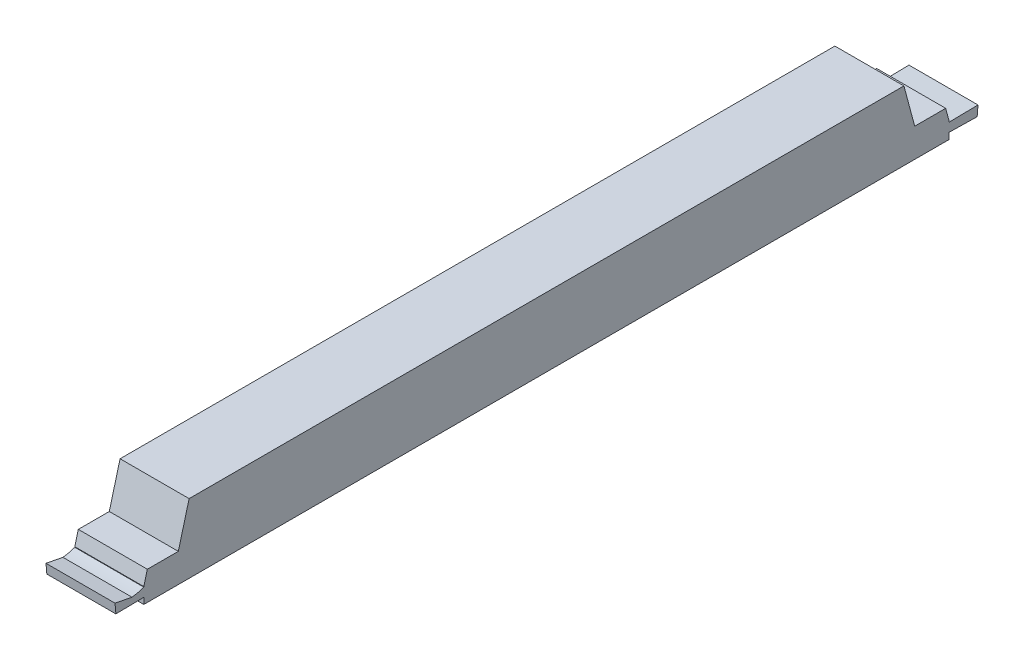
ISO-10303-21;
HEADER;
FILE_DESCRIPTION(('STEP AP214'),'2;1');
FILE_NAME('part.step','',(''),(''),'','','');
FILE_SCHEMA(('AUTOMOTIVE_DESIGN { 1 0 10303 214 1 1 1 1 }'));
ENDSEC;
DATA;
#1=APPLICATION_CONTEXT('core data for automotive mechanical design processes');
#2=APPLICATION_PROTOCOL_DEFINITION('international standard','automotive_design',2000,#1);
#3=PRODUCT_CONTEXT('',#1,'mechanical');
#4=PRODUCT('Part','Part','',(#3));
#5=PRODUCT_RELATED_PRODUCT_CATEGORY('part','',(#4));
#6=PRODUCT_DEFINITION_FORMATION('','',#4);
#7=PRODUCT_DEFINITION_CONTEXT('part definition',#1,'design');
#8=PRODUCT_DEFINITION('design','',#6,#7);
#9=PRODUCT_DEFINITION_SHAPE('','',#8);
#10=(LENGTH_UNIT() NAMED_UNIT(*) SI_UNIT(.MILLI.,.METRE.));
#11=(NAMED_UNIT(*) PLANE_ANGLE_UNIT() SI_UNIT($,.RADIAN.));
#12=(NAMED_UNIT(*) SI_UNIT($,.STERADIAN.) SOLID_ANGLE_UNIT());
#13=UNCERTAINTY_MEASURE_WITH_UNIT(LENGTH_MEASURE(1.E-05),#10,'distance_accuracy_value','');
#14=(GEOMETRIC_REPRESENTATION_CONTEXT(3) GLOBAL_UNCERTAINTY_ASSIGNED_CONTEXT((#13)) GLOBAL_UNIT_ASSIGNED_CONTEXT((#10,
#11,#12)) REPRESENTATION_CONTEXT('',''));
#15=CARTESIAN_POINT('',(0.,0.,0.));
#16=DIRECTION('',(0.,0.,1.));
#17=DIRECTION('',(1.,0.,0.));
#18=AXIS2_PLACEMENT_3D('',#15,#16,#17);
#19=CARTESIAN_POINT('',(0.,0.,150.));
#20=DIRECTION('',(-1.,0.,0.));
#21=DIRECTION('',(0.,0.,1.));
#22=AXIS2_PLACEMENT_3D('',#19,#20,#21);
#23=PLANE('',#22);
#24=DIRECTION('',(0.,-0.996194698091746,0.0871557427476513));
#25=VECTOR('',#24,1.);
#26=CARTESIAN_POINT('',(0.,2.7,0.));
#27=LINE('',#26,#25);
#28=CARTESIAN_POINT('',(0.,2.7,0.));
#29=VERTEX_POINT('',#28);
#30=CARTESIAN_POINT('',(0.,1.00259214599518,0.148503944605277));
#31=VERTEX_POINT('',#30);
#32=EDGE_CURVE('E179',#29,#31,#27,.T.);
#33=ORIENTED_EDGE('',*,*,#32,.T.);
#34=DIRECTION('',(0.,-0.0174524064372764,-0.999847695156391));
#35=VECTOR('',#34,1.);
#36=CARTESIAN_POINT('',(0.,1.08727532464105,5.));
#37=LINE('',#36,#35);
#38=CARTESIAN_POINT('',(0.,1.08727532464105,5.));
#39=VERTEX_POINT('',#38);
#40=EDGE_CURVE('E189',#39,#31,#37,.T.);
#41=ORIENTED_EDGE('',*,*,#40,.F.);
#42=DIRECTION('',(0.,1.,0.));
#43=VECTOR('',#42,1.);
#44=CARTESIAN_POINT('',(0.,0.,5.));
#45=LINE('',#44,#43);
#46=CARTESIAN_POINT('',(0.,0.,5.));
#47=VERTEX_POINT('',#46);
#48=EDGE_CURVE('E297',#47,#39,#45,.T.);
#49=ORIENTED_EDGE('',*,*,#48,.F.);
#50=DIRECTION('',(0.,0.,-1.));
#51=VECTOR('',#50,1.);
#52=CARTESIAN_POINT('',(0.,0.,150.));
#53=LINE('',#52,#51);
#54=CARTESIAN_POINT('',(0.,0.,145.));
#55=VERTEX_POINT('',#54);
#56=EDGE_CURVE('E12',#55,#47,#53,.T.);
#57=ORIENTED_EDGE('',*,*,#56,.F.);
#58=DIRECTION('',(0.,-1.,0.));
#59=VECTOR('',#58,1.);
#60=CARTESIAN_POINT('',(0.,1.,145.));
#61=LINE('',#60,#59);
#62=CARTESIAN_POINT('',(0.,1.08727532464106,145.));
#63=VERTEX_POINT('',#62);
#64=EDGE_CURVE('E290',#63,#55,#61,.T.);
#65=ORIENTED_EDGE('',*,*,#64,.F.);
#66=DIRECTION('',(0.,-0.0174524064372768,0.999847695156391));
#67=VECTOR('',#66,1.);
#68=CARTESIAN_POINT('',(0.,1.08727532464106,145.));
#69=LINE('',#68,#67);
#70=CARTESIAN_POINT('',(0.,1.00259214599518,149.851496055395));
#71=VERTEX_POINT('',#70);
#72=EDGE_CURVE('E228',#63,#71,#69,.T.);
#73=ORIENTED_EDGE('',*,*,#72,.T.);
#74=DIRECTION('',(0.,0.996194698091746,0.0871557427476516));
#75=VECTOR('',#74,1.);
#76=CARTESIAN_POINT('',(0.,1.00259214599518,149.851496055395));
#77=LINE('',#76,#75);
#78=CARTESIAN_POINT('',(0.,2.7,150.));
#79=VERTEX_POINT('',#78);
#80=EDGE_CURVE('E412',#71,#79,#77,.T.);
#81=ORIENTED_EDGE('',*,*,#80,.T.);
#82=DIRECTION('',(0.,0.190808995376531,0.981627183447667));
#83=VECTOR('',#82,1.);
#84=CARTESIAN_POINT('',(0.,2.12757301387041,147.055118449657));
#85=LINE('',#84,#83);
#86=CARTESIAN_POINT('',(0.,2.12757301387041,147.055118449657));
#87=VERTEX_POINT('',#86);
#88=EDGE_CURVE('E399',#87,#79,#85,.T.);
#89=ORIENTED_EDGE('',*,*,#88,.F.);
#90=CARTESIAN_POINT('',(0.,10.0880332251018,147.849519623751));
#91=DIRECTION('',(1.,0.,0.));
#92=DIRECTION('',(0.,0.,-1.));
#93=AXIS2_PLACEMENT_3D('',#90,#91,#92);
#94=CIRCLE('',#93,8.);
#95=CARTESIAN_POINT('',(0.,2.61272467535895,145.));
#96=VERTEX_POINT('',#95);
#97=EDGE_CURVE('E397',#87,#96,#94,.T.);
#98=ORIENTED_EDGE('',*,*,#97,.T.);
#99=DIRECTION('',(0.,-1.,0.));
#100=VECTOR('',#99,1.);
#101=CARTESIAN_POINT('',(0.,2.7,145.));
#102=LINE('',#101,#100);
#103=CARTESIAN_POINT('',(0.,2.7,145.));
#104=VERTEX_POINT('',#103);
#105=EDGE_CURVE('E219',#104,#96,#102,.T.);
#106=ORIENTED_EDGE('',*,*,#105,.F.);
#107=DIRECTION('',(0.,0.965925826289069,-0.258819045102517));
#108=VECTOR('',#107,1.);
#109=CARTESIAN_POINT('',(0.,2.7,145.));
#110=LINE('',#109,#108);
#111=CARTESIAN_POINT('',(0.,5.,144.383716857408));
#112=VERTEX_POINT('',#111);
#113=EDGE_CURVE('E237',#104,#112,#110,.T.);
#114=ORIENTED_EDGE('',*,*,#113,.T.);
#115=DIRECTION('',(0.,0.,-1.));
#116=VECTOR('',#115,1.);
#117=CARTESIAN_POINT('',(0.,5.,144.383716857408));
#118=LINE('',#117,#116);
#119=CARTESIAN_POINT('',(0.,5.,139.));
#120=VERTEX_POINT('',#119);
#121=EDGE_CURVE('E251',#112,#120,#118,.T.);
#122=ORIENTED_EDGE('',*,*,#121,.T.);
#123=DIRECTION('',(0.,0.965925826289069,-0.258819045102518));
#124=VECTOR('',#123,1.);
#125=CARTESIAN_POINT('',(0.,5.,139.));
#126=LINE('',#125,#124);
#127=CARTESIAN_POINT('',(0.,12.,137.124355652982));
#128=VERTEX_POINT('',#127);
#129=EDGE_CURVE('E249',#120,#128,#126,.T.);
#130=ORIENTED_EDGE('',*,*,#129,.T.);
#131=DIRECTION('',(0.,0.,-1.));
#132=VECTOR('',#131,1.);
#133=CARTESIAN_POINT('',(0.,12.,150.));
#134=LINE('',#133,#132);
#135=CARTESIAN_POINT('',(0.,12.,12.8756443470179));
#136=VERTEX_POINT('',#135);
#137=EDGE_CURVE('E50',#128,#136,#134,.T.);
#138=ORIENTED_EDGE('',*,*,#137,.T.);
#139=DIRECTION('',(0.,0.965925826289069,0.25881904510252));
#140=VECTOR('',#139,1.);
#141=CARTESIAN_POINT('',(0.,5.,11.));
#142=LINE('',#141,#140);
#143=CARTESIAN_POINT('',(0.,5.,11.));
#144=VERTEX_POINT('',#143);
#145=EDGE_CURVE('E275',#144,#136,#142,.T.);
#146=ORIENTED_EDGE('',*,*,#145,.F.);
#147=DIRECTION('',(0.,0.,1.));
#148=VECTOR('',#147,1.);
#149=CARTESIAN_POINT('',(0.,5.,5.61628314259158));
#150=LINE('',#149,#148);
#151=CARTESIAN_POINT('',(0.,5.,5.61628314259158));
#152=VERTEX_POINT('',#151);
#153=EDGE_CURVE('E273',#152,#144,#150,.T.);
#154=ORIENTED_EDGE('',*,*,#153,.F.);
#155=DIRECTION('',(0.,0.965925826289069,0.258819045102518));
#156=VECTOR('',#155,1.);
#157=CARTESIAN_POINT('',(0.,2.7,5.));
#158=LINE('',#157,#156);
#159=CARTESIAN_POINT('',(0.,2.7,5.));
#160=VERTEX_POINT('',#159);
#161=EDGE_CURVE('E271',#160,#152,#158,.T.);
#162=ORIENTED_EDGE('',*,*,#161,.F.);
#163=DIRECTION('',(0.,-1.,0.));
#164=VECTOR('',#163,1.);
#165=CARTESIAN_POINT('',(0.,2.7,5.));
#166=LINE('',#165,#164);
#167=CARTESIAN_POINT('',(0.,2.61272467535895,5.));
#168=VERTEX_POINT('',#167);
#169=EDGE_CURVE('E208',#160,#168,#166,.T.);
#170=ORIENTED_EDGE('',*,*,#169,.T.);
#171=DIRECTION('',(0.,0.0174524064372769,-0.999847695156391));
#172=VECTOR('',#171,1.);
#173=CARTESIAN_POINT('',(0.,2.61272467535895,5.));
#174=LINE('',#173,#172);
#175=EDGE_CURVE('E192',#168,#29,#174,.T.);
#176=ORIENTED_EDGE('',*,*,#175,.T.);
#177=EDGE_LOOP('',(#33,#41,#49,#57,#65,#73,#81,#89,#98,#106,#114,#122,#130,#138,#146,#154,#162,
#170,#176));
#178=FACE_BOUND('',#177,.T.);
#179=ADVANCED_FACE('F47',(#178),#23,.T.);
#180=CARTESIAN_POINT('',(12.,0.,150.));
#181=DIRECTION('',(-1.,0.,0.));
#182=DIRECTION('',(0.,0.,1.));
#183=AXIS2_PLACEMENT_3D('',#180,#181,#182);
#184=PLANE('',#183);
#185=DIRECTION('',(0.,-0.0174524064372764,-0.999847695156391));
#186=VECTOR('',#185,1.);
#187=CARTESIAN_POINT('',(12.,1.08727532464105,5.));
#188=LINE('',#187,#186);
#189=CARTESIAN_POINT('',(12.,1.08727532464105,5.));
#190=VERTEX_POINT('',#189);
#191=CARTESIAN_POINT('',(12.,1.00259214599518,0.148503944605275));
#192=VERTEX_POINT('',#191);
#193=EDGE_CURVE('E198',#190,#192,#188,.T.);
#194=ORIENTED_EDGE('',*,*,#193,.T.);
#195=DIRECTION('',(0.,-0.996194698091746,0.0871557427476513));
#196=VECTOR('',#195,1.);
#197=CARTESIAN_POINT('',(12.,2.7,0.));
#198=LINE('',#197,#196);
#199=CARTESIAN_POINT('',(12.,2.7,0.));
#200=VERTEX_POINT('',#199);
#201=EDGE_CURVE('E63',#200,#192,#198,.T.);
#202=ORIENTED_EDGE('',*,*,#201,.F.);
#203=DIRECTION('',(0.,0.0174524064372769,-0.999847695156391));
#204=VECTOR('',#203,1.);
#205=CARTESIAN_POINT('',(12.,2.61272467535895,5.));
#206=LINE('',#205,#204);
#207=CARTESIAN_POINT('',(12.,2.61272467535895,5.));
#208=VERTEX_POINT('',#207);
#209=EDGE_CURVE('E210',#208,#200,#206,.T.);
#210=ORIENTED_EDGE('',*,*,#209,.F.);
#211=DIRECTION('',(0.,-1.,0.));
#212=VECTOR('',#211,1.);
#213=CARTESIAN_POINT('',(12.,2.7,5.));
#214=LINE('',#213,#212);
#215=CARTESIAN_POINT('',(12.,2.7,5.));
#216=VERTEX_POINT('',#215);
#217=EDGE_CURVE('E213',#216,#208,#214,.T.);
#218=ORIENTED_EDGE('',*,*,#217,.F.);
#219=DIRECTION('',(0.,0.965925826289069,0.258819045102518));
#220=VECTOR('',#219,1.);
#221=CARTESIAN_POINT('',(12.,2.7,5.));
#222=LINE('',#221,#220);
#223=CARTESIAN_POINT('',(12.,5.,5.61628314259158));
#224=VERTEX_POINT('',#223);
#225=EDGE_CURVE('E262',#216,#224,#222,.T.);
#226=ORIENTED_EDGE('',*,*,#225,.T.);
#227=DIRECTION('',(0.,0.,1.));
#228=VECTOR('',#227,1.);
#229=CARTESIAN_POINT('',(12.,5.,5.61628314259158));
#230=LINE('',#229,#228);
#231=CARTESIAN_POINT('',(12.,5.,11.));
#232=VERTEX_POINT('',#231);
#233=EDGE_CURVE('E265',#224,#232,#230,.T.);
#234=ORIENTED_EDGE('',*,*,#233,.T.);
#235=DIRECTION('',(0.,0.965925826289069,0.25881904510252));
#236=VECTOR('',#235,1.);
#237=CARTESIAN_POINT('',(12.,5.,11.));
#238=LINE('',#237,#236);
#239=CARTESIAN_POINT('',(12.,12.,12.8756443470179));
#240=VERTEX_POINT('',#239);
#241=EDGE_CURVE('E268',#232,#240,#238,.T.);
#242=ORIENTED_EDGE('',*,*,#241,.T.);
#243=DIRECTION('',(0.,0.,-1.));
#244=VECTOR('',#243,1.);
#245=CARTESIAN_POINT('',(12.,12.,150.));
#246=LINE('',#245,#244);
#247=CARTESIAN_POINT('',(12.,12.,137.124355652982));
#248=VERTEX_POINT('',#247);
#249=EDGE_CURVE('E302',#248,#240,#246,.T.);
#250=ORIENTED_EDGE('',*,*,#249,.F.);
#251=DIRECTION('',(0.,0.965925826289069,-0.258819045102518));
#252=VECTOR('',#251,1.);
#253=CARTESIAN_POINT('',(12.,5.,139.));
#254=LINE('',#253,#252);
#255=CARTESIAN_POINT('',(12.,5.,139.));
#256=VERTEX_POINT('',#255);
#257=EDGE_CURVE('E257',#256,#248,#254,.T.);
#258=ORIENTED_EDGE('',*,*,#257,.F.);
#259=DIRECTION('',(0.,0.,-1.));
#260=VECTOR('',#259,1.);
#261=CARTESIAN_POINT('',(12.,5.,144.383716857408));
#262=LINE('',#261,#260);
#263=CARTESIAN_POINT('',(12.,5.,144.383716857408));
#264=VERTEX_POINT('',#263);
#265=EDGE_CURVE('E259',#264,#256,#262,.T.);
#266=ORIENTED_EDGE('',*,*,#265,.F.);
#267=DIRECTION('',(0.,0.965925826289069,-0.258819045102517));
#268=VECTOR('',#267,1.);
#269=CARTESIAN_POINT('',(12.,2.7,145.));
#270=LINE('',#269,#268);
#271=CARTESIAN_POINT('',(12.,2.7,145.));
#272=VERTEX_POINT('',#271);
#273=EDGE_CURVE('E254',#272,#264,#270,.T.);
#274=ORIENTED_EDGE('',*,*,#273,.F.);
#275=DIRECTION('',(0.,-1.,0.));
#276=VECTOR('',#275,1.);
#277=CARTESIAN_POINT('',(12.,2.7,145.));
#278=LINE('',#277,#276);
#279=CARTESIAN_POINT('',(12.,2.61272467535895,145.));
#280=VERTEX_POINT('',#279);
#281=EDGE_CURVE('E222',#272,#280,#278,.T.);
#282=ORIENTED_EDGE('',*,*,#281,.T.);
#283=CARTESIAN_POINT('',(12.,10.0880332251018,147.849519623751));
#284=DIRECTION('',(1.,0.,0.));
#285=DIRECTION('',(0.,0.,-1.));
#286=AXIS2_PLACEMENT_3D('',#283,#284,#285);
#287=CIRCLE('',#286,8.);
#288=CARTESIAN_POINT('',(12.,2.12757301387041,147.055118449657));
#289=VERTEX_POINT('',#288);
#290=EDGE_CURVE('E403',#289,#280,#287,.T.);
#291=ORIENTED_EDGE('',*,*,#290,.F.);
#292=DIRECTION('',(0.,0.190808995376531,0.981627183447667));
#293=VECTOR('',#292,1.);
#294=CARTESIAN_POINT('',(12.,2.12757301387041,147.055118449657));
#295=LINE('',#294,#293);
#296=CARTESIAN_POINT('',(12.,2.7,150.));
#297=VERTEX_POINT('',#296);
#298=EDGE_CURVE('E405',#289,#297,#295,.T.);
#299=ORIENTED_EDGE('',*,*,#298,.T.);
#300=DIRECTION('',(0.,0.996194698091746,0.0871557427476516));
#301=VECTOR('',#300,1.);
#302=CARTESIAN_POINT('',(12.,1.00259214599518,149.851496055395));
#303=LINE('',#302,#301);
#304=CARTESIAN_POINT('',(12.,1.00259214599518,149.851496055395));
#305=VERTEX_POINT('',#304);
#306=EDGE_CURVE('E409',#305,#297,#303,.T.);
#307=ORIENTED_EDGE('',*,*,#306,.F.);
#308=DIRECTION('',(0.,-0.0174524064372768,0.999847695156391));
#309=VECTOR('',#308,1.);
#310=CARTESIAN_POINT('',(12.,1.08727532464106,145.));
#311=LINE('',#310,#309);
#312=CARTESIAN_POINT('',(12.,1.08727532464106,145.));
#313=VERTEX_POINT('',#312);
#314=EDGE_CURVE('E225',#313,#305,#311,.T.);
#315=ORIENTED_EDGE('',*,*,#314,.F.);
#316=DIRECTION('',(0.,-1.,0.));
#317=VECTOR('',#316,1.);
#318=CARTESIAN_POINT('',(12.,1.,145.));
#319=LINE('',#318,#317);
#320=CARTESIAN_POINT('',(12.,0.,145.));
#321=VERTEX_POINT('',#320);
#322=EDGE_CURVE('E292',#313,#321,#319,.T.);
#323=ORIENTED_EDGE('',*,*,#322,.T.);
#324=DIRECTION('',(0.,0.,-1.));
#325=VECTOR('',#324,1.);
#326=CARTESIAN_POINT('',(12.,0.,150.));
#327=LINE('',#326,#325);
#328=CARTESIAN_POINT('',(12.,0.,5.));
#329=VERTEX_POINT('',#328);
#330=EDGE_CURVE('E55',#321,#329,#327,.T.);
#331=ORIENTED_EDGE('',*,*,#330,.T.);
#332=DIRECTION('',(0.,1.,0.));
#333=VECTOR('',#332,1.);
#334=CARTESIAN_POINT('',(12.,0.,5.));
#335=LINE('',#334,#333);
#336=EDGE_CURVE('E295',#329,#190,#335,.T.);
#337=ORIENTED_EDGE('',*,*,#336,.T.);
#338=EDGE_LOOP('',(#194,#202,#210,#218,#226,#234,#242,#250,#258,#266,#274,#282,#291,#299,#307,
#315,#323,#331,#337));
#339=FACE_BOUND('',#338,.T.);
#340=ADVANCED_FACE('F313',(#339),#184,.F.);
#341=CARTESIAN_POINT('',(0.,12.,150.));
#342=DIRECTION('',(0.,1.,0.));
#343=DIRECTION('',(0.,0.,1.));
#344=AXIS2_PLACEMENT_3D('',#341,#342,#343);
#345=PLANE('',#344);
#346=DIRECTION('',(1.,0.,0.));
#347=VECTOR('',#346,1.);
#348=CARTESIAN_POINT('',(0.,12.,137.124355652982));
#349=LINE('',#348,#347);
#350=EDGE_CURVE('E238',#128,#248,#349,.T.);
#351=ORIENTED_EDGE('',*,*,#350,.T.);
#352=ORIENTED_EDGE('',*,*,#249,.T.);
#353=DIRECTION('',(1.,0.,0.));
#354=VECTOR('',#353,1.);
#355=CARTESIAN_POINT('',(0.,12.,12.8756443470179));
#356=LINE('',#355,#354);
#357=EDGE_CURVE('E277',#136,#240,#356,.T.);
#358=ORIENTED_EDGE('',*,*,#357,.F.);
#359=ORIENTED_EDGE('',*,*,#137,.F.);
#360=EDGE_LOOP('',(#351,#352,#358,#359));
#361=FACE_BOUND('',#360,.T.);
#362=ADVANCED_FACE('F306',(#361),#345,.T.);
#363=CARTESIAN_POINT('',(0.,0.,150.));
#364=DIRECTION('',(0.,1.,0.));
#365=DIRECTION('',(0.,0.,1.));
#366=AXIS2_PLACEMENT_3D('',#363,#364,#365);
#367=PLANE('',#366);
#368=DIRECTION('',(1.,0.,0.));
#369=VECTOR('',#368,1.);
#370=CARTESIAN_POINT('',(0.,0.,145.));
#371=LINE('',#370,#369);
#372=EDGE_CURVE('E288',#55,#321,#371,.T.);
#373=ORIENTED_EDGE('',*,*,#372,.F.);
#374=ORIENTED_EDGE('',*,*,#56,.T.);
#375=DIRECTION('',(1.,0.,0.));
#376=VECTOR('',#375,1.);
#377=CARTESIAN_POINT('',(0.,0.,5.));
#378=LINE('',#377,#376);
#379=EDGE_CURVE('E299',#47,#329,#378,.T.);
#380=ORIENTED_EDGE('',*,*,#379,.T.);
#381=ORIENTED_EDGE('',*,*,#330,.F.);
#382=EDGE_LOOP('',(#373,#374,#380,#381));
#383=FACE_BOUND('',#382,.T.);
#384=ADVANCED_FACE('F351',(#383),#367,.F.);
#385=CARTESIAN_POINT('',(0.,0.,5.));
#386=DIRECTION('',(0.,0.,-1.));
#387=DIRECTION('',(-1.,0.,0.));
#388=AXIS2_PLACEMENT_3D('',#385,#386,#387);
#389=PLANE('',#388);
#390=ORIENTED_EDGE('',*,*,#336,.F.);
#391=ORIENTED_EDGE('',*,*,#379,.F.);
#392=ORIENTED_EDGE('',*,*,#48,.T.);
#393=DIRECTION('',(1.,0.,0.));
#394=VECTOR('',#393,1.);
#395=CARTESIAN_POINT('',(0.,1.08727532464105,5.));
#396=LINE('',#395,#394);
#397=EDGE_CURVE('E197',#39,#190,#396,.T.);
#398=ORIENTED_EDGE('',*,*,#397,.T.);
#399=EDGE_LOOP('',(#390,#391,#392,#398));
#400=FACE_BOUND('',#399,.T.);
#401=ADVANCED_FACE('F355',(#400),#389,.T.);
#402=CARTESIAN_POINT('',(0.,1.,145.));
#403=DIRECTION('',(0.,0.,1.));
#404=DIRECTION('',(1.,0.,0.));
#405=AXIS2_PLACEMENT_3D('',#402,#403,#404);
#406=PLANE('',#405);
#407=ORIENTED_EDGE('',*,*,#322,.F.);
#408=DIRECTION('',(1.,0.,0.));
#409=VECTOR('',#408,1.);
#410=CARTESIAN_POINT('',(0.,1.08727532464106,145.));
#411=LINE('',#410,#409);
#412=EDGE_CURVE('E231',#63,#313,#411,.T.);
#413=ORIENTED_EDGE('',*,*,#412,.F.);
#414=ORIENTED_EDGE('',*,*,#64,.T.);
#415=ORIENTED_EDGE('',*,*,#372,.T.);
#416=EDGE_LOOP('',(#407,#413,#414,#415));
#417=FACE_BOUND('',#416,.T.);
#418=ADVANCED_FACE('F359',(#417),#406,.T.);
#419=CARTESIAN_POINT('',(0.,2.7,5.));
#420=DIRECTION('',(0.,0.258819045102518,-0.965925826289069));
#421=DIRECTION('',(0.,0.965925826289069,0.258819045102518));
#422=AXIS2_PLACEMENT_3D('',#419,#420,#421);
#423=PLANE('',#422);
#424=ORIENTED_EDGE('',*,*,#225,.F.);
#425=DIRECTION('',(1.,0.,0.));
#426=VECTOR('',#425,1.);
#427=CARTESIAN_POINT('',(0.,2.7,5.));
#428=LINE('',#427,#426);
#429=EDGE_CURVE('E284',#160,#216,#428,.T.);
#430=ORIENTED_EDGE('',*,*,#429,.F.);
#431=ORIENTED_EDGE('',*,*,#161,.T.);
#432=DIRECTION('',(1.,0.,0.));
#433=VECTOR('',#432,1.);
#434=CARTESIAN_POINT('',(0.,5.,5.61628314259158));
#435=LINE('',#434,#433);
#436=EDGE_CURVE('E282',#152,#224,#435,.T.);
#437=ORIENTED_EDGE('',*,*,#436,.T.);
#438=EDGE_LOOP('',(#424,#430,#431,#437));
#439=FACE_BOUND('',#438,.T.);
#440=ADVANCED_FACE('F324',(#439),#423,.T.);
#441=CARTESIAN_POINT('',(0.,5.,5.61628314259158));
#442=DIRECTION('',(0.,1.,0.));
#443=DIRECTION('',(0.,0.,1.));
#444=AXIS2_PLACEMENT_3D('',#441,#442,#443);
#445=PLANE('',#444);
#446=ORIENTED_EDGE('',*,*,#233,.F.);
#447=ORIENTED_EDGE('',*,*,#436,.F.);
#448=ORIENTED_EDGE('',*,*,#153,.T.);
#449=DIRECTION('',(1.,0.,0.));
#450=VECTOR('',#449,1.);
#451=CARTESIAN_POINT('',(0.,5.,11.));
#452=LINE('',#451,#450);
#453=EDGE_CURVE('E280',#144,#232,#452,.T.);
#454=ORIENTED_EDGE('',*,*,#453,.T.);
#455=EDGE_LOOP('',(#446,#447,#448,#454));
#456=FACE_BOUND('',#455,.T.);
#457=ADVANCED_FACE('F319',(#456),#445,.T.);
#458=CARTESIAN_POINT('',(0.,5.,11.));
#459=DIRECTION('',(0.,0.25881904510252,-0.965925826289069));
#460=DIRECTION('',(0.,0.965925826289069,0.25881904510252));
#461=AXIS2_PLACEMENT_3D('',#458,#459,#460);
#462=PLANE('',#461);
#463=ORIENTED_EDGE('',*,*,#241,.F.);
#464=ORIENTED_EDGE('',*,*,#453,.F.);
#465=ORIENTED_EDGE('',*,*,#145,.T.);
#466=ORIENTED_EDGE('',*,*,#357,.T.);
#467=EDGE_LOOP('',(#463,#464,#465,#466));
#468=FACE_BOUND('',#467,.T.);
#469=ADVANCED_FACE('F311',(#468),#462,.T.);
#470=CARTESIAN_POINT('',(0.,5.,144.383716857408));
#471=DIRECTION('',(0.,-1.,0.));
#472=DIRECTION('',(0.,0.,-1.));
#473=AXIS2_PLACEMENT_3D('',#470,#471,#472);
#474=PLANE('',#473);
#475=ORIENTED_EDGE('',*,*,#265,.T.);
#476=DIRECTION('',(1.,0.,0.));
#477=VECTOR('',#476,1.);
#478=CARTESIAN_POINT('',(0.,5.,139.));
#479=LINE('',#478,#477);
#480=EDGE_CURVE('E235',#120,#256,#479,.T.);
#481=ORIENTED_EDGE('',*,*,#480,.F.);
#482=ORIENTED_EDGE('',*,*,#121,.F.);
#483=DIRECTION('',(1.,0.,0.));
#484=VECTOR('',#483,1.);
#485=CARTESIAN_POINT('',(0.,5.,144.383716857408));
#486=LINE('',#485,#484);
#487=EDGE_CURVE('E234',#112,#264,#486,.T.);
#488=ORIENTED_EDGE('',*,*,#487,.T.);
#489=EDGE_LOOP('',(#475,#481,#482,#488));
#490=FACE_BOUND('',#489,.T.);
#491=ADVANCED_FACE('F370',(#490),#474,.F.);
#492=CARTESIAN_POINT('',(0.,2.7,145.));
#493=DIRECTION('',(0.,-0.258819045102517,-0.965925826289069));
#494=DIRECTION('',(0.,0.965925826289069,-0.258819045102517));
#495=AXIS2_PLACEMENT_3D('',#492,#493,#494);
#496=PLANE('',#495);
#497=ORIENTED_EDGE('',*,*,#273,.T.);
#498=ORIENTED_EDGE('',*,*,#487,.F.);
#499=ORIENTED_EDGE('',*,*,#113,.F.);
#500=DIRECTION('',(1.,0.,0.));
#501=VECTOR('',#500,1.);
#502=CARTESIAN_POINT('',(0.,2.7,145.));
#503=LINE('',#502,#501);
#504=EDGE_CURVE('E243',#104,#272,#503,.T.);
#505=ORIENTED_EDGE('',*,*,#504,.T.);
#506=EDGE_LOOP('',(#497,#498,#499,#505));
#507=FACE_BOUND('',#506,.T.);
#508=ADVANCED_FACE('F371',(#507),#496,.F.);
#509=CARTESIAN_POINT('',(0.,5.,139.));
#510=DIRECTION('',(0.,-0.258819045102518,-0.965925826289069));
#511=DIRECTION('',(0.,0.965925826289069,-0.258819045102518));
#512=AXIS2_PLACEMENT_3D('',#509,#510,#511);
#513=PLANE('',#512);
#514=ORIENTED_EDGE('',*,*,#257,.T.);
#515=ORIENTED_EDGE('',*,*,#350,.F.);
#516=ORIENTED_EDGE('',*,*,#129,.F.);
#517=ORIENTED_EDGE('',*,*,#480,.T.);
#518=EDGE_LOOP('',(#514,#515,#516,#517));
#519=FACE_BOUND('',#518,.T.);
#520=ADVANCED_FACE('F374',(#519),#513,.F.);
#521=CARTESIAN_POINT('',(0.,1.08727532464106,145.));
#522=DIRECTION('',(0.,0.999847695156391,0.0174524064372768));
#523=DIRECTION('',(0.,-0.0174524064372768,0.999847695156391));
#524=AXIS2_PLACEMENT_3D('',#521,#522,#523);
#525=PLANE('',#524);
#526=ORIENTED_EDGE('',*,*,#314,.T.);
#527=DIRECTION('',(1.,0.,0.));
#528=VECTOR('',#527,1.);
#529=CARTESIAN_POINT('',(0.,1.00259214599518,149.851496055395));
#530=LINE('',#529,#528);
#531=EDGE_CURVE('E202',#71,#305,#530,.T.);
#532=ORIENTED_EDGE('',*,*,#531,.F.);
#533=ORIENTED_EDGE('',*,*,#72,.F.);
#534=ORIENTED_EDGE('',*,*,#412,.T.);
#535=EDGE_LOOP('',(#526,#532,#533,#534));
#536=FACE_BOUND('',#535,.T.);
#537=ADVANCED_FACE('F378',(#536),#525,.F.);
#538=CARTESIAN_POINT('',(0.,2.7,145.));
#539=DIRECTION('',(0.,0.,1.));
#540=DIRECTION('',(1.,0.,0.));
#541=AXIS2_PLACEMENT_3D('',#538,#539,#540);
#542=PLANE('',#541);
#543=ORIENTED_EDGE('',*,*,#281,.F.);
#544=ORIENTED_EDGE('',*,*,#504,.F.);
#545=ORIENTED_EDGE('',*,*,#105,.T.);
#546=DIRECTION('',(1.,0.,0.));
#547=VECTOR('',#546,1.);
#548=CARTESIAN_POINT('',(0.,2.61272467535895,145.));
#549=LINE('',#548,#547);
#550=EDGE_CURVE('E216',#96,#280,#549,.T.);
#551=ORIENTED_EDGE('',*,*,#550,.T.);
#552=EDGE_LOOP('',(#543,#544,#545,#551));
#553=FACE_BOUND('',#552,.T.);
#554=ADVANCED_FACE('F339',(#553),#542,.T.);
#555=CARTESIAN_POINT('',(0.,2.7,5.));
#556=DIRECTION('',(0.,0.,1.));
#557=DIRECTION('',(0.,-1.,0.));
#558=AXIS2_PLACEMENT_3D('',#555,#556,#557);
#559=PLANE('',#558);
#560=ORIENTED_EDGE('',*,*,#217,.T.);
#561=DIRECTION('',(1.,0.,0.));
#562=VECTOR('',#561,1.);
#563=CARTESIAN_POINT('',(0.,2.61272467535895,5.));
#564=LINE('',#563,#562);
#565=EDGE_CURVE('E200',#168,#208,#564,.T.);
#566=ORIENTED_EDGE('',*,*,#565,.F.);
#567=ORIENTED_EDGE('',*,*,#169,.F.);
#568=ORIENTED_EDGE('',*,*,#429,.T.);
#569=EDGE_LOOP('',(#560,#566,#567,#568));
#570=FACE_BOUND('',#569,.T.);
#571=ADVANCED_FACE('F326',(#570),#559,.F.);
#572=CARTESIAN_POINT('',(0.,2.61272467535895,5.));
#573=DIRECTION('',(0.,-0.999847695156391,-0.0174524064372769));
#574=DIRECTION('',(0.,0.0174524064372769,-0.999847695156391));
#575=AXIS2_PLACEMENT_3D('',#572,#573,#574);
#576=PLANE('',#575);
#577=ORIENTED_EDGE('',*,*,#209,.T.);
#578=DIRECTION('',(1.,0.,0.));
#579=VECTOR('',#578,1.);
#580=CARTESIAN_POINT('',(0.,2.7,0.));
#581=LINE('',#580,#579);
#582=EDGE_CURVE('E286',#29,#200,#581,.T.);
#583=ORIENTED_EDGE('',*,*,#582,.F.);
#584=ORIENTED_EDGE('',*,*,#175,.F.);
#585=ORIENTED_EDGE('',*,*,#565,.T.);
#586=EDGE_LOOP('',(#577,#583,#584,#585));
#587=FACE_BOUND('',#586,.T.);
#588=ADVANCED_FACE('F329',(#587),#576,.F.);
#589=CARTESIAN_POINT('',(0.,1.08727532464105,5.));
#590=DIRECTION('',(0.,-0.999847695156391,0.0174524064372764));
#591=DIRECTION('',(0.,-0.0174524064372764,-0.999847695156391));
#592=AXIS2_PLACEMENT_3D('',#589,#590,#591);
#593=PLANE('',#592);
#594=DIRECTION('',(1.,0.,0.));
#595=VECTOR('',#594,1.);
#596=CARTESIAN_POINT('',(0.,1.00259214599518,0.148503944605277));
#597=LINE('',#596,#595);
#598=EDGE_CURVE('E176',#31,#192,#597,.T.);
#599=ORIENTED_EDGE('',*,*,#598,.T.);
#600=ORIENTED_EDGE('',*,*,#193,.F.);
#601=ORIENTED_EDGE('',*,*,#397,.F.);
#602=ORIENTED_EDGE('',*,*,#40,.T.);
#603=EDGE_LOOP('',(#599,#600,#601,#602));
#604=FACE_BOUND('',#603,.T.);
#605=ADVANCED_FACE('F195',(#604),#593,.T.);
#606=CARTESIAN_POINT('',(0.,1.00259214599518,149.851496055395));
#607=DIRECTION('',(0.,0.0871557427476516,-0.996194698091746));
#608=DIRECTION('',(0.,0.996194698091746,0.0871557427476516));
#609=AXIS2_PLACEMENT_3D('',#606,#607,#608);
#610=PLANE('',#609);
#611=ORIENTED_EDGE('',*,*,#306,.T.);
#612=DIRECTION('',(1.,0.,0.));
#613=VECTOR('',#612,1.);
#614=CARTESIAN_POINT('',(0.,2.7,150.));
#615=LINE('',#614,#613);
#616=EDGE_CURVE('E241',#79,#297,#615,.T.);
#617=ORIENTED_EDGE('',*,*,#616,.F.);
#618=ORIENTED_EDGE('',*,*,#80,.F.);
#619=ORIENTED_EDGE('',*,*,#531,.T.);
#620=EDGE_LOOP('',(#611,#617,#618,#619));
#621=FACE_BOUND('',#620,.T.);
#622=ADVANCED_FACE('F336',(#621),#610,.F.);
#623=CARTESIAN_POINT('',(0.,2.12757301387041,147.055118449657));
#624=DIRECTION('',(0.,0.981627183447667,-0.190808995376531));
#625=DIRECTION('',(0.,0.190808995376531,0.981627183447667));
#626=AXIS2_PLACEMENT_3D('',#623,#624,#625);
#627=PLANE('',#626);
#628=ORIENTED_EDGE('',*,*,#298,.F.);
#629=DIRECTION('',(1.,0.,0.));
#630=VECTOR('',#629,1.);
#631=CARTESIAN_POINT('',(0.,2.12757301387041,147.055118449657));
#632=LINE('',#631,#630);
#633=EDGE_CURVE('E401',#87,#289,#632,.T.);
#634=ORIENTED_EDGE('',*,*,#633,.F.);
#635=ORIENTED_EDGE('',*,*,#88,.T.);
#636=ORIENTED_EDGE('',*,*,#616,.T.);
#637=EDGE_LOOP('',(#628,#634,#635,#636));
#638=FACE_BOUND('',#637,.T.);
#639=ADVANCED_FACE('F431',(#638),#627,.T.);
#640=CARTESIAN_POINT('',(0.,10.0880332251018,147.849519623751));
#641=DIRECTION('',(1.,0.,0.));
#642=DIRECTION('',(0.,0.,-1.));
#643=AXIS2_PLACEMENT_3D('',#640,#641,#642);
#644=CYLINDRICAL_SURFACE('',#643,8.);
#645=ORIENTED_EDGE('',*,*,#290,.T.);
#646=ORIENTED_EDGE('',*,*,#550,.F.);
#647=ORIENTED_EDGE('',*,*,#97,.F.);
#648=ORIENTED_EDGE('',*,*,#633,.T.);
#649=EDGE_LOOP('',(#645,#646,#647,#648));
#650=FACE_BOUND('',#649,.T.);
#651=ADVANCED_FACE('F430',(#650),#644,.F.);
#652=CARTESIAN_POINT('',(0.,2.7,0.));
#653=DIRECTION('',(0.,0.0871557427476513,0.996194698091746));
#654=DIRECTION('',(0.,-0.996194698091746,0.0871557427476513));
#655=AXIS2_PLACEMENT_3D('',#652,#653,#654);
#656=PLANE('',#655);
#657=ORIENTED_EDGE('',*,*,#201,.T.);
#658=ORIENTED_EDGE('',*,*,#598,.F.);
#659=ORIENTED_EDGE('',*,*,#32,.F.);
#660=ORIENTED_EDGE('',*,*,#582,.T.);
#661=EDGE_LOOP('',(#657,#658,#659,#660));
#662=FACE_BOUND('',#661,.T.);
#663=ADVANCED_FACE('F178',(#662),#656,.F.);
#664=CLOSED_SHELL('',(#179,#340,#362,#384,#401,#418,#440,#457,#469,#491,#508,#520,#537,#554,
#571,#588,#605,#622,#639,#651,#663));
#665=MANIFOLD_SOLID_BREP('B2',#664);
#666=ADVANCED_BREP_SHAPE_REPRESENTATION('',(#18,#665),#14);
#667=SHAPE_DEFINITION_REPRESENTATION(#9,#666);
ENDSEC;
END-ISO-10303-21;
